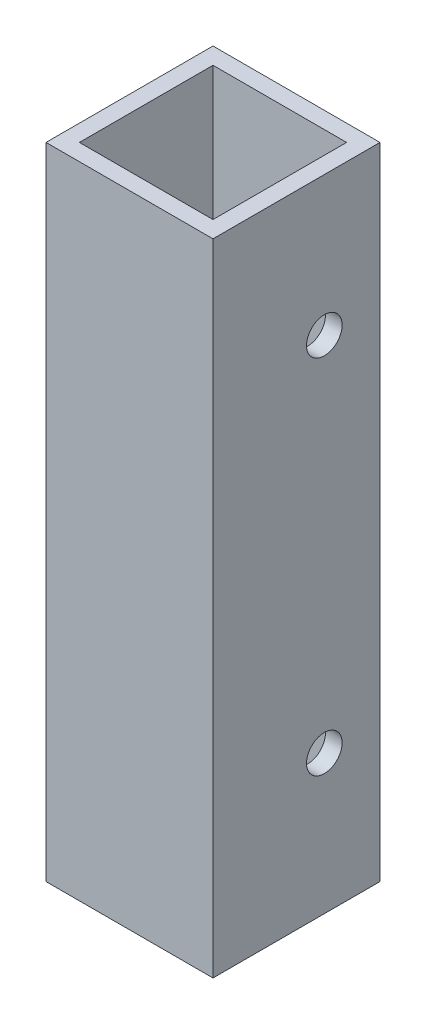
ISO-10303-21;
HEADER;
FILE_DESCRIPTION(('STEP AP214'),'2;1');
FILE_NAME('part.step','',(''),(''),'','','');
FILE_SCHEMA(('AUTOMOTIVE_DESIGN { 1 0 10303 214 1 1 1 1 }'));
ENDSEC;
DATA;
#1=APPLICATION_CONTEXT('core data for automotive mechanical design processes');
#2=APPLICATION_PROTOCOL_DEFINITION('international standard','automotive_design',2000,#1);
#3=PRODUCT_CONTEXT('',#1,'mechanical');
#4=PRODUCT('Part','Part','',(#3));
#5=PRODUCT_RELATED_PRODUCT_CATEGORY('part','',(#4));
#6=PRODUCT_DEFINITION_FORMATION('','',#4);
#7=PRODUCT_DEFINITION_CONTEXT('part definition',#1,'design');
#8=PRODUCT_DEFINITION('design','',#6,#7);
#9=PRODUCT_DEFINITION_SHAPE('','',#8);
#10=(LENGTH_UNIT() NAMED_UNIT(*) SI_UNIT(.MILLI.,.METRE.));
#11=(NAMED_UNIT(*) PLANE_ANGLE_UNIT() SI_UNIT($,.RADIAN.));
#12=(NAMED_UNIT(*) SI_UNIT($,.STERADIAN.) SOLID_ANGLE_UNIT());
#13=UNCERTAINTY_MEASURE_WITH_UNIT(LENGTH_MEASURE(1.E-05),#10,'distance_accuracy_value','');
#14=(GEOMETRIC_REPRESENTATION_CONTEXT(3) GLOBAL_UNCERTAINTY_ASSIGNED_CONTEXT((#13)) GLOBAL_UNIT_ASSIGNED_CONTEXT((#10,
#11,#12)) REPRESENTATION_CONTEXT('',''));
#15=CARTESIAN_POINT('',(0.,0.,0.));
#16=DIRECTION('',(0.,0.,1.));
#17=DIRECTION('',(1.,0.,0.));
#18=AXIS2_PLACEMENT_3D('',#15,#16,#17);
#19=CARTESIAN_POINT('',(0.,57.5,0.));
#20=DIRECTION('',(0.,-1.,0.));
#21=DIRECTION('',(0.,0.,-1.));
#22=AXIS2_PLACEMENT_3D('',#19,#20,#21);
#23=PLANE('',#22);
#24=DIRECTION('',(0.,0.,1.));
#25=VECTOR('',#24,1.);
#26=CARTESIAN_POINT('',(0.,57.5,0.));
#27=LINE('',#26,#25);
#28=CARTESIAN_POINT('',(0.,57.5,-15.));
#29=VERTEX_POINT('',#28);
#30=CARTESIAN_POINT('',(0.,57.5,0.));
#31=VERTEX_POINT('',#30);
#32=EDGE_CURVE('E162',#29,#31,#27,.T.);
#33=ORIENTED_EDGE('',*,*,#32,.T.);
#34=DIRECTION('',(1.,0.,0.));
#35=VECTOR('',#34,1.);
#36=CARTESIAN_POINT('',(0.,57.5,0.));
#37=LINE('',#36,#35);
#38=CARTESIAN_POINT('',(15.,57.5,0.));
#39=VERTEX_POINT('',#38);
#40=EDGE_CURVE('E166',#31,#39,#37,.T.);
#41=ORIENTED_EDGE('',*,*,#40,.T.);
#42=DIRECTION('',(0.,0.,-1.));
#43=VECTOR('',#42,1.);
#44=CARTESIAN_POINT('',(15.,57.5,0.));
#45=LINE('',#44,#43);
#46=CARTESIAN_POINT('',(15.,57.5,-15.));
#47=VERTEX_POINT('',#46);
#48=EDGE_CURVE('E170',#39,#47,#45,.T.);
#49=ORIENTED_EDGE('',*,*,#48,.T.);
#50=DIRECTION('',(-1.,0.,0.));
#51=VECTOR('',#50,1.);
#52=CARTESIAN_POINT('',(0.,57.5,-15.));
#53=LINE('',#52,#51);
#54=EDGE_CURVE('E173',#47,#29,#53,.T.);
#55=ORIENTED_EDGE('',*,*,#54,.T.);
#56=EDGE_LOOP('',(#33,#41,#49,#55));
#57=FACE_BOUND('',#56,.T.);
#58=DIRECTION('',(1.,0.,0.));
#59=VECTOR('',#58,1.);
#60=CARTESIAN_POINT('',(1.5,57.5,-1.5));
#61=LINE('',#60,#59);
#62=CARTESIAN_POINT('',(1.5,57.5,-1.5));
#63=VERTEX_POINT('',#62);
#64=CARTESIAN_POINT('',(13.5,57.5,-1.5));
#65=VERTEX_POINT('',#64);
#66=EDGE_CURVE('E112',#63,#65,#61,.T.);
#67=ORIENTED_EDGE('',*,*,#66,.F.);
#68=DIRECTION('',(0.,0.,1.));
#69=VECTOR('',#68,1.);
#70=CARTESIAN_POINT('',(1.5,57.5,-1.5));
#71=LINE('',#70,#69);
#72=CARTESIAN_POINT('',(1.5,57.5,-13.5));
#73=VERTEX_POINT('',#72);
#74=EDGE_CURVE('E138',#73,#63,#71,.T.);
#75=ORIENTED_EDGE('',*,*,#74,.F.);
#76=DIRECTION('',(-1.,0.,0.));
#77=VECTOR('',#76,1.);
#78=CARTESIAN_POINT('',(1.5,57.5,-13.5));
#79=LINE('',#78,#77);
#80=CARTESIAN_POINT('',(13.5,57.5,-13.5));
#81=VERTEX_POINT('',#80);
#82=EDGE_CURVE('E134',#81,#73,#79,.T.);
#83=ORIENTED_EDGE('',*,*,#82,.F.);
#84=DIRECTION('',(0.,0.,-1.));
#85=VECTOR('',#84,1.);
#86=CARTESIAN_POINT('',(13.5,57.5,-1.5));
#87=LINE('',#86,#85);
#88=EDGE_CURVE('E121',#65,#81,#87,.T.);
#89=ORIENTED_EDGE('',*,*,#88,.F.);
#90=EDGE_LOOP('',(#67,#75,#83,#89));
#91=FACE_BOUND('',#90,.T.);
#92=ADVANCED_FACE('F44',(#57,#91),#23,.F.);
#93=CARTESIAN_POINT('',(0.,0.,0.));
#94=DIRECTION('',(0.,-1.,0.));
#95=DIRECTION('',(0.,0.,-1.));
#96=AXIS2_PLACEMENT_3D('',#93,#94,#95);
#97=PLANE('',#96);
#98=DIRECTION('',(0.,0.,1.));
#99=VECTOR('',#98,1.);
#100=CARTESIAN_POINT('',(0.,0.,0.));
#101=LINE('',#100,#99);
#102=CARTESIAN_POINT('',(0.,0.,-15.));
#103=VERTEX_POINT('',#102);
#104=CARTESIAN_POINT('',(0.,0.,0.));
#105=VERTEX_POINT('',#104);
#106=EDGE_CURVE('E130',#103,#105,#101,.T.);
#107=ORIENTED_EDGE('',*,*,#106,.F.);
#108=DIRECTION('',(-1.,0.,0.));
#109=VECTOR('',#108,1.);
#110=CARTESIAN_POINT('',(0.,0.,-15.));
#111=LINE('',#110,#109);
#112=CARTESIAN_POINT('',(15.,0.,-15.));
#113=VERTEX_POINT('',#112);
#114=EDGE_CURVE('E167',#113,#103,#111,.T.);
#115=ORIENTED_EDGE('',*,*,#114,.F.);
#116=DIRECTION('',(0.,0.,-1.));
#117=VECTOR('',#116,1.);
#118=CARTESIAN_POINT('',(15.,0.,0.));
#119=LINE('',#118,#117);
#120=CARTESIAN_POINT('',(15.,0.,0.));
#121=VERTEX_POINT('',#120);
#122=EDGE_CURVE('E183',#121,#113,#119,.T.);
#123=ORIENTED_EDGE('',*,*,#122,.F.);
#124=DIRECTION('',(1.,0.,0.));
#125=VECTOR('',#124,1.);
#126=CARTESIAN_POINT('',(0.,0.,0.));
#127=LINE('',#126,#125);
#128=EDGE_CURVE('E180',#105,#121,#127,.T.);
#129=ORIENTED_EDGE('',*,*,#128,.F.);
#130=EDGE_LOOP('',(#107,#115,#123,#129));
#131=FACE_BOUND('',#130,.T.);
#132=DIRECTION('',(0.,0.,1.));
#133=VECTOR('',#132,1.);
#134=CARTESIAN_POINT('',(1.5,0.,-1.5));
#135=LINE('',#134,#133);
#136=CARTESIAN_POINT('',(1.5,0.,-13.5));
#137=VERTEX_POINT('',#136);
#138=CARTESIAN_POINT('',(1.5,0.,-1.5));
#139=VERTEX_POINT('',#138);
#140=EDGE_CURVE('E122',#137,#139,#135,.T.);
#141=ORIENTED_EDGE('',*,*,#140,.T.);
#142=DIRECTION('',(1.,0.,0.));
#143=VECTOR('',#142,1.);
#144=CARTESIAN_POINT('',(1.5,0.,-1.5));
#145=LINE('',#144,#143);
#146=CARTESIAN_POINT('',(13.5,0.,-1.5));
#147=VERTEX_POINT('',#146);
#148=EDGE_CURVE('E70',#139,#147,#145,.T.);
#149=ORIENTED_EDGE('',*,*,#148,.T.);
#150=DIRECTION('',(0.,0.,-1.));
#151=VECTOR('',#150,1.);
#152=CARTESIAN_POINT('',(13.5,0.,-1.5));
#153=LINE('',#152,#151);
#154=CARTESIAN_POINT('',(13.5,0.,-13.5));
#155=VERTEX_POINT('',#154);
#156=EDGE_CURVE('E128',#147,#155,#153,.T.);
#157=ORIENTED_EDGE('',*,*,#156,.T.);
#158=DIRECTION('',(-1.,0.,0.));
#159=VECTOR('',#158,1.);
#160=CARTESIAN_POINT('',(1.5,0.,-13.5));
#161=LINE('',#160,#159);
#162=EDGE_CURVE('E149',#155,#137,#161,.T.);
#163=ORIENTED_EDGE('',*,*,#162,.T.);
#164=EDGE_LOOP('',(#141,#149,#157,#163));
#165=FACE_BOUND('',#164,.T.);
#166=ADVANCED_FACE('F243',(#131,#165),#97,.T.);
#167=CARTESIAN_POINT('',(0.,57.5,0.));
#168=DIRECTION('',(1.,0.,0.));
#169=DIRECTION('',(0.,0.,-1.));
#170=AXIS2_PLACEMENT_3D('',#167,#168,#169);
#171=PLANE('',#170);
#172=CARTESIAN_POINT('',(0.,12.5,-10.));
#173=DIRECTION('',(-1.,0.,0.));
#174=DIRECTION('',(0.,0.,1.));
#175=AXIS2_PLACEMENT_3D('',#172,#173,#174);
#176=CIRCLE('',#175,1.59999999999999);
#177=CARTESIAN_POINT('',(0.,12.5,-8.40000000000001));
#178=VERTEX_POINT('',#177);
#179=EDGE_CURVE('E209',#178,#178,#176,.T.);
#180=ORIENTED_EDGE('',*,*,#179,.F.);
#181=EDGE_LOOP('',(#180));
#182=FACE_BOUND('',#181,.T.);
#183=CARTESIAN_POINT('',(0.,45.,-10.));
#184=DIRECTION('',(-1.,0.,0.));
#185=DIRECTION('',(0.,0.,1.));
#186=AXIS2_PLACEMENT_3D('',#183,#184,#185);
#187=CIRCLE('',#186,1.60000000000001);
#188=CARTESIAN_POINT('',(0.,45.,-8.4));
#189=VERTEX_POINT('',#188);
#190=EDGE_CURVE('E215',#189,#189,#187,.T.);
#191=ORIENTED_EDGE('',*,*,#190,.F.);
#192=EDGE_LOOP('',(#191));
#193=FACE_BOUND('',#192,.T.);
#194=ORIENTED_EDGE('',*,*,#106,.T.);
#195=DIRECTION('',(0.,-1.,0.));
#196=VECTOR('',#195,1.);
#197=CARTESIAN_POINT('',(0.,57.5,0.));
#198=LINE('',#197,#196);
#199=EDGE_CURVE('E11',#31,#105,#198,.T.);
#200=ORIENTED_EDGE('',*,*,#199,.F.);
#201=ORIENTED_EDGE('',*,*,#32,.F.);
#202=DIRECTION('',(0.,-1.,0.));
#203=VECTOR('',#202,1.);
#204=CARTESIAN_POINT('',(0.,57.5,-15.));
#205=LINE('',#204,#203);
#206=EDGE_CURVE('E176',#29,#103,#205,.T.);
#207=ORIENTED_EDGE('',*,*,#206,.T.);
#208=EDGE_LOOP('',(#194,#200,#201,#207));
#209=FACE_BOUND('',#208,.T.);
#210=ADVANCED_FACE('F46',(#182,#193,#209),#171,.F.);
#211=CARTESIAN_POINT('',(0.,57.5,0.));
#212=DIRECTION('',(0.,0.,-1.));
#213=DIRECTION('',(-1.,0.,0.));
#214=AXIS2_PLACEMENT_3D('',#211,#212,#213);
#215=PLANE('',#214);
#216=ORIENTED_EDGE('',*,*,#128,.T.);
#217=DIRECTION('',(0.,-1.,0.));
#218=VECTOR('',#217,1.);
#219=CARTESIAN_POINT('',(15.,57.5,0.));
#220=LINE('',#219,#218);
#221=EDGE_CURVE('E54',#39,#121,#220,.T.);
#222=ORIENTED_EDGE('',*,*,#221,.F.);
#223=ORIENTED_EDGE('',*,*,#40,.F.);
#224=ORIENTED_EDGE('',*,*,#199,.T.);
#225=EDGE_LOOP('',(#216,#222,#223,#224));
#226=FACE_BOUND('',#225,.T.);
#227=ADVANCED_FACE('F270',(#226),#215,.F.);
#228=CARTESIAN_POINT('',(15.,57.5,0.));
#229=DIRECTION('',(-1.,0.,0.));
#230=DIRECTION('',(0.,0.,1.));
#231=AXIS2_PLACEMENT_3D('',#228,#229,#230);
#232=PLANE('',#231);
#233=CARTESIAN_POINT('',(15.,12.5,-10.));
#234=DIRECTION('',(-1.,0.,0.));
#235=DIRECTION('',(0.,0.,1.));
#236=AXIS2_PLACEMENT_3D('',#233,#234,#235);
#237=CIRCLE('',#236,1.59999999999999);
#238=CARTESIAN_POINT('',(15.,12.5,-8.40000000000001));
#239=VERTEX_POINT('',#238);
#240=EDGE_CURVE('E201',#239,#239,#237,.T.);
#241=ORIENTED_EDGE('',*,*,#240,.T.);
#242=EDGE_LOOP('',(#241));
#243=FACE_BOUND('',#242,.T.);
#244=CARTESIAN_POINT('',(15.,45.,-10.));
#245=DIRECTION('',(-1.,0.,0.));
#246=DIRECTION('',(0.,0.,1.));
#247=AXIS2_PLACEMENT_3D('',#244,#245,#246);
#248=CIRCLE('',#247,1.60000000000001);
#249=CARTESIAN_POINT('',(15.,45.,-8.4));
#250=VERTEX_POINT('',#249);
#251=EDGE_CURVE('E221',#250,#250,#248,.T.);
#252=ORIENTED_EDGE('',*,*,#251,.T.);
#253=EDGE_LOOP('',(#252));
#254=FACE_BOUND('',#253,.T.);
#255=ORIENTED_EDGE('',*,*,#122,.T.);
#256=DIRECTION('',(0.,-1.,0.));
#257=VECTOR('',#256,1.);
#258=CARTESIAN_POINT('',(15.,57.5,-15.));
#259=LINE('',#258,#257);
#260=EDGE_CURVE('E191',#47,#113,#259,.T.);
#261=ORIENTED_EDGE('',*,*,#260,.F.);
#262=ORIENTED_EDGE('',*,*,#48,.F.);
#263=ORIENTED_EDGE('',*,*,#221,.T.);
#264=EDGE_LOOP('',(#255,#261,#262,#263));
#265=FACE_BOUND('',#264,.T.);
#266=ADVANCED_FACE('F267',(#243,#254,#265),#232,.F.);
#267=CARTESIAN_POINT('',(0.,57.5,-15.));
#268=DIRECTION('',(0.,0.,1.));
#269=DIRECTION('',(1.,0.,0.));
#270=AXIS2_PLACEMENT_3D('',#267,#268,#269);
#271=PLANE('',#270);
#272=ORIENTED_EDGE('',*,*,#114,.T.);
#273=ORIENTED_EDGE('',*,*,#206,.F.);
#274=ORIENTED_EDGE('',*,*,#54,.F.);
#275=ORIENTED_EDGE('',*,*,#260,.T.);
#276=EDGE_LOOP('',(#272,#273,#274,#275));
#277=FACE_BOUND('',#276,.T.);
#278=ADVANCED_FACE('F264',(#277),#271,.F.);
#279=CARTESIAN_POINT('',(1.5,57.5,-1.5));
#280=DIRECTION('',(0.,0.,-1.));
#281=DIRECTION('',(-1.,0.,0.));
#282=AXIS2_PLACEMENT_3D('',#279,#280,#281);
#283=PLANE('',#282);
#284=ORIENTED_EDGE('',*,*,#148,.F.);
#285=DIRECTION('',(0.,-1.,0.));
#286=VECTOR('',#285,1.);
#287=CARTESIAN_POINT('',(1.5,57.5,-1.5));
#288=LINE('',#287,#286);
#289=EDGE_CURVE('E116',#63,#139,#288,.T.);
#290=ORIENTED_EDGE('',*,*,#289,.F.);
#291=ORIENTED_EDGE('',*,*,#66,.T.);
#292=DIRECTION('',(0.,-1.,0.));
#293=VECTOR('',#292,1.);
#294=CARTESIAN_POINT('',(13.5,57.5,-1.5));
#295=LINE('',#294,#293);
#296=EDGE_CURVE('E115',#65,#147,#295,.T.);
#297=ORIENTED_EDGE('',*,*,#296,.T.);
#298=EDGE_LOOP('',(#284,#290,#291,#297));
#299=FACE_BOUND('',#298,.T.);
#300=ADVANCED_FACE('F114',(#299),#283,.T.);
#301=CARTESIAN_POINT('',(13.5,57.5,-1.5));
#302=DIRECTION('',(-1.,0.,0.));
#303=DIRECTION('',(0.,0.,1.));
#304=AXIS2_PLACEMENT_3D('',#301,#302,#303);
#305=PLANE('',#304);
#306=CARTESIAN_POINT('',(13.5,12.5,-10.));
#307=DIRECTION('',(-1.,0.,0.));
#308=DIRECTION('',(0.,0.,1.));
#309=AXIS2_PLACEMENT_3D('',#306,#307,#308);
#310=CIRCLE('',#309,1.59999999999999);
#311=CARTESIAN_POINT('',(13.5,12.5,-8.40000000000001));
#312=VERTEX_POINT('',#311);
#313=EDGE_CURVE('E146',#312,#312,#310,.T.);
#314=ORIENTED_EDGE('',*,*,#313,.F.);
#315=EDGE_LOOP('',(#314));
#316=FACE_BOUND('',#315,.T.);
#317=CARTESIAN_POINT('',(13.5,45.,-10.));
#318=DIRECTION('',(-1.,0.,0.));
#319=DIRECTION('',(0.,0.,1.));
#320=AXIS2_PLACEMENT_3D('',#317,#318,#319);
#321=CIRCLE('',#320,1.60000000000001);
#322=CARTESIAN_POINT('',(13.5,45.,-8.4));
#323=VERTEX_POINT('',#322);
#324=EDGE_CURVE('E200',#323,#323,#321,.T.);
#325=ORIENTED_EDGE('',*,*,#324,.F.);
#326=EDGE_LOOP('',(#325));
#327=FACE_BOUND('',#326,.T.);
#328=ORIENTED_EDGE('',*,*,#156,.F.);
#329=ORIENTED_EDGE('',*,*,#296,.F.);
#330=ORIENTED_EDGE('',*,*,#88,.T.);
#331=DIRECTION('',(0.,-1.,0.));
#332=VECTOR('',#331,1.);
#333=CARTESIAN_POINT('',(13.5,57.5,-13.5));
#334=LINE('',#333,#332);
#335=EDGE_CURVE('E131',#81,#155,#334,.T.);
#336=ORIENTED_EDGE('',*,*,#335,.T.);
#337=EDGE_LOOP('',(#328,#329,#330,#336));
#338=FACE_BOUND('',#337,.T.);
#339=ADVANCED_FACE('F125',(#316,#327,#338),#305,.T.);
#340=CARTESIAN_POINT('',(1.5,57.5,-13.5));
#341=DIRECTION('',(0.,0.,1.));
#342=DIRECTION('',(1.,0.,0.));
#343=AXIS2_PLACEMENT_3D('',#340,#341,#342);
#344=PLANE('',#343);
#345=ORIENTED_EDGE('',*,*,#162,.F.);
#346=ORIENTED_EDGE('',*,*,#335,.F.);
#347=ORIENTED_EDGE('',*,*,#82,.T.);
#348=DIRECTION('',(0.,-1.,0.));
#349=VECTOR('',#348,1.);
#350=CARTESIAN_POINT('',(1.5,57.5,-13.5));
#351=LINE('',#350,#349);
#352=EDGE_CURVE('E62',#73,#137,#351,.T.);
#353=ORIENTED_EDGE('',*,*,#352,.T.);
#354=EDGE_LOOP('',(#345,#346,#347,#353));
#355=FACE_BOUND('',#354,.T.);
#356=ADVANCED_FACE('F239',(#355),#344,.T.);
#357=CARTESIAN_POINT('',(1.5,57.5,-1.5));
#358=DIRECTION('',(1.,0.,0.));
#359=DIRECTION('',(0.,0.,-1.));
#360=AXIS2_PLACEMENT_3D('',#357,#358,#359);
#361=PLANE('',#360);
#362=CARTESIAN_POINT('',(1.5,12.5,-10.));
#363=DIRECTION('',(1.,0.,0.));
#364=DIRECTION('',(0.,0.,-1.));
#365=AXIS2_PLACEMENT_3D('',#362,#363,#364);
#366=CIRCLE('',#365,1.59999999999999);
#367=CARTESIAN_POINT('',(1.5,12.5,-11.6));
#368=VERTEX_POINT('',#367);
#369=EDGE_CURVE('E48',#368,#368,#366,.T.);
#370=ORIENTED_EDGE('',*,*,#369,.F.);
#371=EDGE_LOOP('',(#370));
#372=FACE_BOUND('',#371,.T.);
#373=CARTESIAN_POINT('',(1.5,45.,-10.));
#374=DIRECTION('',(1.,0.,0.));
#375=DIRECTION('',(0.,0.,-1.));
#376=AXIS2_PLACEMENT_3D('',#373,#374,#375);
#377=CIRCLE('',#376,1.60000000000001);
#378=CARTESIAN_POINT('',(1.5,45.,-11.6));
#379=VERTEX_POINT('',#378);
#380=EDGE_CURVE('E197',#379,#379,#377,.T.);
#381=ORIENTED_EDGE('',*,*,#380,.F.);
#382=EDGE_LOOP('',(#381));
#383=FACE_BOUND('',#382,.T.);
#384=ORIENTED_EDGE('',*,*,#140,.F.);
#385=ORIENTED_EDGE('',*,*,#352,.F.);
#386=ORIENTED_EDGE('',*,*,#74,.T.);
#387=ORIENTED_EDGE('',*,*,#289,.T.);
#388=EDGE_LOOP('',(#384,#385,#386,#387));
#389=FACE_BOUND('',#388,.T.);
#390=ADVANCED_FACE('F235',(#372,#383,#389),#361,.T.);
#391=CARTESIAN_POINT('',(15.,45.,-10.));
#392=DIRECTION('',(-1.,0.,0.));
#393=DIRECTION('',(0.,0.,1.));
#394=AXIS2_PLACEMENT_3D('',#391,#392,#393);
#395=CYLINDRICAL_SURFACE('',#394,1.60000000000001);
#396=ORIENTED_EDGE('',*,*,#380,.T.);
#397=EDGE_LOOP('',(#396));
#398=FACE_BOUND('',#397,.T.);
#399=ORIENTED_EDGE('',*,*,#190,.T.);
#400=EDGE_LOOP('',(#399));
#401=FACE_BOUND('',#400,.T.);
#402=ADVANCED_FACE('F238',(#398,#401),#395,.F.);
#403=CARTESIAN_POINT('',(15.,12.5,-10.));
#404=DIRECTION('',(-1.,0.,0.));
#405=DIRECTION('',(0.,0.,1.));
#406=AXIS2_PLACEMENT_3D('',#403,#404,#405);
#407=CYLINDRICAL_SURFACE('',#406,1.59999999999999);
#408=ORIENTED_EDGE('',*,*,#369,.T.);
#409=EDGE_LOOP('',(#408));
#410=FACE_BOUND('',#409,.T.);
#411=ORIENTED_EDGE('',*,*,#179,.T.);
#412=EDGE_LOOP('',(#411));
#413=FACE_BOUND('',#412,.T.);
#414=ADVANCED_FACE('F232',(#410,#413),#407,.F.);
#415=ORIENTED_EDGE('',*,*,#324,.T.);
#416=EDGE_LOOP('',(#415));
#417=FACE_BOUND('',#416,.T.);
#418=ORIENTED_EDGE('',*,*,#251,.F.);
#419=EDGE_LOOP('',(#418));
#420=FACE_BOUND('',#419,.T.);
#421=ADVANCED_FACE('F296',(#417,#420),#395,.F.);
#422=ORIENTED_EDGE('',*,*,#313,.T.);
#423=EDGE_LOOP('',(#422));
#424=FACE_BOUND('',#423,.T.);
#425=ORIENTED_EDGE('',*,*,#240,.F.);
#426=EDGE_LOOP('',(#425));
#427=FACE_BOUND('',#426,.T.);
#428=ADVANCED_FACE('F301',(#424,#427),#407,.F.);
#429=CLOSED_SHELL('',(#92,#166,#210,#227,#266,#278,#300,#339,#356,#390,#402,#414,#421,#428));
#430=MANIFOLD_SOLID_BREP('B2',#429);
#431=ADVANCED_BREP_SHAPE_REPRESENTATION('',(#18,#430),#14);
#432=SHAPE_DEFINITION_REPRESENTATION(#9,#431);
ENDSEC;
END-ISO-10303-21;
